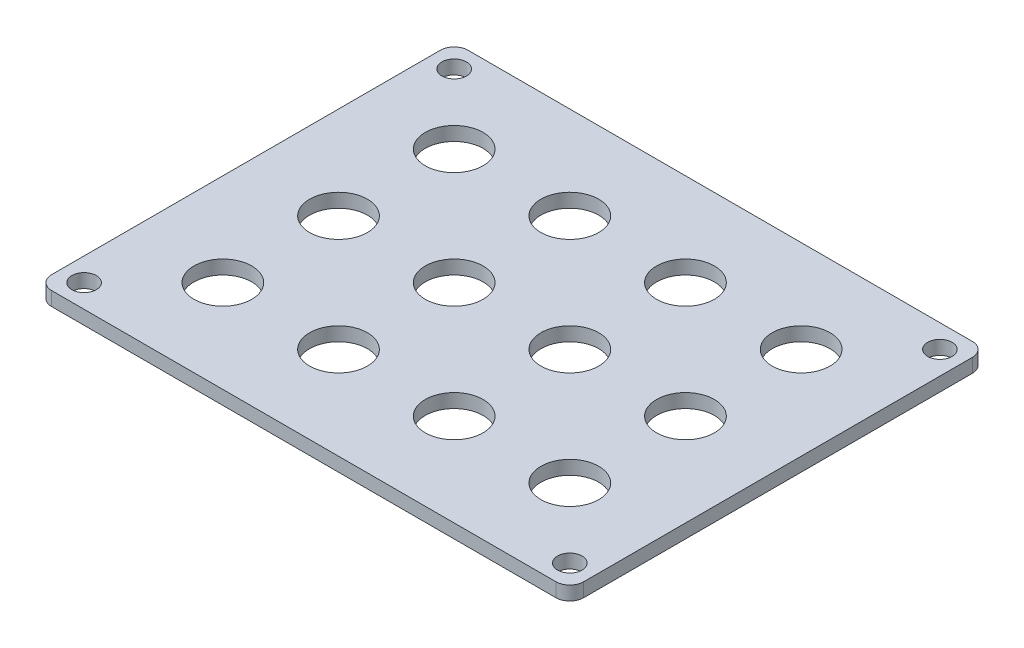
ISO-10303-21;
HEADER;
FILE_DESCRIPTION(('STEP AP214'),'2;1');
FILE_NAME('part.step','',(''),(''),'','','');
FILE_SCHEMA(('AUTOMOTIVE_DESIGN { 1 0 10303 214 1 1 1 1 }'));
ENDSEC;
DATA;
#1=APPLICATION_CONTEXT('core data for automotive mechanical design processes');
#2=APPLICATION_PROTOCOL_DEFINITION('international standard','automotive_design',2000,#1);
#3=PRODUCT_CONTEXT('',#1,'mechanical');
#4=PRODUCT('Part','Part','',(#3));
#5=PRODUCT_RELATED_PRODUCT_CATEGORY('part','',(#4));
#6=PRODUCT_DEFINITION_FORMATION('','',#4);
#7=PRODUCT_DEFINITION_CONTEXT('part definition',#1,'design');
#8=PRODUCT_DEFINITION('design','',#6,#7);
#9=PRODUCT_DEFINITION_SHAPE('','',#8);
#10=(LENGTH_UNIT() NAMED_UNIT(*) SI_UNIT(.MILLI.,.METRE.));
#11=(NAMED_UNIT(*) PLANE_ANGLE_UNIT() SI_UNIT($,.RADIAN.));
#12=(NAMED_UNIT(*) SI_UNIT($,.STERADIAN.) SOLID_ANGLE_UNIT());
#13=UNCERTAINTY_MEASURE_WITH_UNIT(LENGTH_MEASURE(1.E-05),#10,'distance_accuracy_value','');
#14=(GEOMETRIC_REPRESENTATION_CONTEXT(3) GLOBAL_UNCERTAINTY_ASSIGNED_CONTEXT((#13)) GLOBAL_UNIT_ASSIGNED_CONTEXT((#10,
#11,#12)) REPRESENTATION_CONTEXT('',''));
#15=CARTESIAN_POINT('',(0.,0.,0.));
#16=DIRECTION('',(0.,0.,1.));
#17=DIRECTION('',(1.,0.,0.));
#18=AXIS2_PLACEMENT_3D('',#15,#16,#17);
#19=CARTESIAN_POINT('',(0.,3.,0.));
#20=DIRECTION('',(0.,-1.,0.));
#21=DIRECTION('',(0.,0.,-1.));
#22=AXIS2_PLACEMENT_3D('',#19,#20,#21);
#23=PLANE('',#22);
#24=CARTESIAN_POINT('',(45.,3.,-70.));
#25=DIRECTION('',(0.,1.,0.));
#26=DIRECTION('',(0.,0.,1.));
#27=AXIS2_PLACEMENT_3D('',#24,#25,#26);
#28=CIRCLE('',#27,6.25);
#29=CARTESIAN_POINT('',(45.,3.,-63.75));
#30=VERTEX_POINT('',#29);
#31=EDGE_CURVE('E244',#30,#30,#28,.T.);
#32=ORIENTED_EDGE('',*,*,#31,.F.);
#33=EDGE_LOOP('',(#32));
#34=FACE_BOUND('',#33,.T.);
#35=CARTESIAN_POINT('',(20.,3.,-70.));
#36=DIRECTION('',(0.,1.,0.));
#37=DIRECTION('',(0.,0.,1.));
#38=AXIS2_PLACEMENT_3D('',#35,#36,#37);
#39=CIRCLE('',#38,6.25);
#40=CARTESIAN_POINT('',(20.,3.,-63.75));
#41=VERTEX_POINT('',#40);
#42=EDGE_CURVE('E231',#41,#41,#39,.T.);
#43=ORIENTED_EDGE('',*,*,#42,.F.);
#44=EDGE_LOOP('',(#43));
#45=FACE_BOUND('',#44,.T.);
#46=DIRECTION('',(0.,0.,-1.));
#47=VECTOR('',#46,1.);
#48=CARTESIAN_POINT('',(115.,3.,0.));
#49=LINE('',#48,#47);
#50=CARTESIAN_POINT('',(115.,3.,-3.));
#51=VERTEX_POINT('',#50);
#52=CARTESIAN_POINT('',(115.,3.,-87.));
#53=VERTEX_POINT('',#52);
#54=EDGE_CURVE('E235',#51,#53,#49,.T.);
#55=ORIENTED_EDGE('',*,*,#54,.T.);
#56=CARTESIAN_POINT('',(112.,3.,-87.));
#57=DIRECTION('',(0.,-1.,0.));
#58=DIRECTION('',(0.,0.,-1.));
#59=AXIS2_PLACEMENT_3D('',#56,#57,#58);
#60=CIRCLE('',#59,3.);
#61=CARTESIAN_POINT('',(112.,3.,-90.));
#62=VERTEX_POINT('',#61);
#63=EDGE_CURVE('E212',#53,#62,#60,.F.);
#64=ORIENTED_EDGE('',*,*,#63,.T.);
#65=DIRECTION('',(-1.,0.,0.));
#66=VECTOR('',#65,1.);
#67=CARTESIAN_POINT('',(0.,3.,-90.));
#68=LINE('',#67,#66);
#69=CARTESIAN_POINT('',(3.,3.,-90.));
#70=VERTEX_POINT('',#69);
#71=EDGE_CURVE('E123',#62,#70,#68,.T.);
#72=ORIENTED_EDGE('',*,*,#71,.T.);
#73=CARTESIAN_POINT('',(3.,3.,-87.));
#74=DIRECTION('',(0.,-1.,0.));
#75=DIRECTION('',(0.,0.,-1.));
#76=AXIS2_PLACEMENT_3D('',#73,#74,#75);
#77=CIRCLE('',#76,3.);
#78=CARTESIAN_POINT('',(0.,3.,-87.));
#79=VERTEX_POINT('',#78);
#80=EDGE_CURVE('E207',#70,#79,#77,.F.);
#81=ORIENTED_EDGE('',*,*,#80,.T.);
#82=DIRECTION('',(0.,0.,1.));
#83=VECTOR('',#82,1.);
#84=CARTESIAN_POINT('',(0.,3.,0.));
#85=LINE('',#84,#83);
#86=CARTESIAN_POINT('',(0.,3.,-3.));
#87=VERTEX_POINT('',#86);
#88=EDGE_CURVE('E130',#79,#87,#85,.T.);
#89=ORIENTED_EDGE('',*,*,#88,.T.);
#90=CARTESIAN_POINT('',(3.,3.,-3.));
#91=DIRECTION('',(0.,-1.,0.));
#92=DIRECTION('',(0.,0.,-1.));
#93=AXIS2_PLACEMENT_3D('',#90,#91,#92);
#94=CIRCLE('',#93,3.);
#95=CARTESIAN_POINT('',(3.,3.,0.));
#96=VERTEX_POINT('',#95);
#97=EDGE_CURVE('E59',#87,#96,#94,.F.);
#98=ORIENTED_EDGE('',*,*,#97,.T.);
#99=DIRECTION('',(1.,0.,0.));
#100=VECTOR('',#99,1.);
#101=CARTESIAN_POINT('',(0.,3.,0.));
#102=LINE('',#101,#100);
#103=CARTESIAN_POINT('',(112.,3.,0.));
#104=VERTEX_POINT('',#103);
#105=EDGE_CURVE('E133',#96,#104,#102,.T.);
#106=ORIENTED_EDGE('',*,*,#105,.T.);
#107=CARTESIAN_POINT('',(112.,3.,-3.));
#108=DIRECTION('',(0.,-1.,0.));
#109=DIRECTION('',(0.,0.,-1.));
#110=AXIS2_PLACEMENT_3D('',#107,#108,#109);
#111=CIRCLE('',#110,3.);
#112=EDGE_CURVE('E210',#104,#51,#111,.F.);
#113=ORIENTED_EDGE('',*,*,#112,.T.);
#114=EDGE_LOOP('',(#55,#64,#72,#81,#89,#98,#106,#113));
#115=FACE_BOUND('',#114,.T.);
#116=CARTESIAN_POINT('',(70.,3.,-70.));
#117=DIRECTION('',(0.,1.,0.));
#118=DIRECTION('',(0.,0.,1.));
#119=AXIS2_PLACEMENT_3D('',#116,#117,#118);
#120=CIRCLE('',#119,6.25);
#121=CARTESIAN_POINT('',(70.,3.,-63.75));
#122=VERTEX_POINT('',#121);
#123=EDGE_CURVE('E139',#122,#122,#120,.T.);
#124=ORIENTED_EDGE('',*,*,#123,.F.);
#125=EDGE_LOOP('',(#124));
#126=FACE_BOUND('',#125,.T.);
#127=CARTESIAN_POINT('',(95.,3.,-70.));
#128=DIRECTION('',(0.,1.,0.));
#129=DIRECTION('',(0.,0.,1.));
#130=AXIS2_PLACEMENT_3D('',#127,#128,#129);
#131=CIRCLE('',#130,6.25);
#132=CARTESIAN_POINT('',(95.,3.,-63.75));
#133=VERTEX_POINT('',#132);
#134=EDGE_CURVE('E145',#133,#133,#131,.T.);
#135=ORIENTED_EDGE('',*,*,#134,.F.);
#136=EDGE_LOOP('',(#135));
#137=FACE_BOUND('',#136,.T.);
#138=CARTESIAN_POINT('',(20.,3.,-45.));
#139=DIRECTION('',(0.,1.,0.));
#140=DIRECTION('',(0.,0.,1.));
#141=AXIS2_PLACEMENT_3D('',#138,#139,#140);
#142=CIRCLE('',#141,6.25);
#143=CARTESIAN_POINT('',(20.,3.,-38.75));
#144=VERTEX_POINT('',#143);
#145=EDGE_CURVE('E151',#144,#144,#142,.T.);
#146=ORIENTED_EDGE('',*,*,#145,.F.);
#147=EDGE_LOOP('',(#146));
#148=FACE_BOUND('',#147,.T.);
#149=CARTESIAN_POINT('',(45.,3.,-45.));
#150=DIRECTION('',(0.,1.,0.));
#151=DIRECTION('',(0.,0.,1.));
#152=AXIS2_PLACEMENT_3D('',#149,#150,#151);
#153=CIRCLE('',#152,6.25);
#154=CARTESIAN_POINT('',(45.,3.,-38.75));
#155=VERTEX_POINT('',#154);
#156=EDGE_CURVE('E157',#155,#155,#153,.T.);
#157=ORIENTED_EDGE('',*,*,#156,.F.);
#158=EDGE_LOOP('',(#157));
#159=FACE_BOUND('',#158,.T.);
#160=CARTESIAN_POINT('',(70.,3.,-45.));
#161=DIRECTION('',(0.,1.,0.));
#162=DIRECTION('',(0.,0.,1.));
#163=AXIS2_PLACEMENT_3D('',#160,#161,#162);
#164=CIRCLE('',#163,6.25);
#165=CARTESIAN_POINT('',(70.,3.,-38.75));
#166=VERTEX_POINT('',#165);
#167=EDGE_CURVE('E163',#166,#166,#164,.T.);
#168=ORIENTED_EDGE('',*,*,#167,.F.);
#169=EDGE_LOOP('',(#168));
#170=FACE_BOUND('',#169,.T.);
#171=CARTESIAN_POINT('',(95.,3.,-45.));
#172=DIRECTION('',(0.,1.,0.));
#173=DIRECTION('',(0.,0.,1.));
#174=AXIS2_PLACEMENT_3D('',#171,#172,#173);
#175=CIRCLE('',#174,6.25);
#176=CARTESIAN_POINT('',(95.,3.,-38.75));
#177=VERTEX_POINT('',#176);
#178=EDGE_CURVE('E169',#177,#177,#175,.T.);
#179=ORIENTED_EDGE('',*,*,#178,.F.);
#180=EDGE_LOOP('',(#179));
#181=FACE_BOUND('',#180,.T.);
#182=CARTESIAN_POINT('',(20.,3.,-20.));
#183=DIRECTION('',(0.,1.,0.));
#184=DIRECTION('',(0.,0.,1.));
#185=AXIS2_PLACEMENT_3D('',#182,#183,#184);
#186=CIRCLE('',#185,6.25);
#187=CARTESIAN_POINT('',(20.,3.,-13.75));
#188=VERTEX_POINT('',#187);
#189=EDGE_CURVE('E175',#188,#188,#186,.T.);
#190=ORIENTED_EDGE('',*,*,#189,.F.);
#191=EDGE_LOOP('',(#190));
#192=FACE_BOUND('',#191,.T.);
#193=CARTESIAN_POINT('',(45.,3.,-20.));
#194=DIRECTION('',(0.,1.,0.));
#195=DIRECTION('',(0.,0.,1.));
#196=AXIS2_PLACEMENT_3D('',#193,#194,#195);
#197=CIRCLE('',#196,6.25);
#198=CARTESIAN_POINT('',(45.,3.,-13.75));
#199=VERTEX_POINT('',#198);
#200=EDGE_CURVE('E181',#199,#199,#197,.T.);
#201=ORIENTED_EDGE('',*,*,#200,.F.);
#202=EDGE_LOOP('',(#201));
#203=FACE_BOUND('',#202,.T.);
#204=CARTESIAN_POINT('',(70.,3.,-20.));
#205=DIRECTION('',(0.,1.,0.));
#206=DIRECTION('',(0.,0.,1.));
#207=AXIS2_PLACEMENT_3D('',#204,#205,#206);
#208=CIRCLE('',#207,6.25);
#209=CARTESIAN_POINT('',(70.,3.,-13.75));
#210=VERTEX_POINT('',#209);
#211=EDGE_CURVE('E187',#210,#210,#208,.T.);
#212=ORIENTED_EDGE('',*,*,#211,.F.);
#213=EDGE_LOOP('',(#212));
#214=FACE_BOUND('',#213,.T.);
#215=CARTESIAN_POINT('',(95.,3.,-20.));
#216=DIRECTION('',(0.,1.,0.));
#217=DIRECTION('',(0.,0.,1.));
#218=AXIS2_PLACEMENT_3D('',#215,#216,#217);
#219=CIRCLE('',#218,6.25);
#220=CARTESIAN_POINT('',(95.,3.,-13.75));
#221=VERTEX_POINT('',#220);
#222=EDGE_CURVE('E193',#221,#221,#219,.T.);
#223=ORIENTED_EDGE('',*,*,#222,.F.);
#224=EDGE_LOOP('',(#223));
#225=FACE_BOUND('',#224,.T.);
#226=CARTESIAN_POINT('',(110.,3.,-85.));
#227=DIRECTION('',(0.,1.,0.));
#228=DIRECTION('',(0.,0.,1.));
#229=AXIS2_PLACEMENT_3D('',#226,#227,#228);
#230=CIRCLE('',#229,2.65);
#231=CARTESIAN_POINT('',(110.,3.,-82.35));
#232=VERTEX_POINT('',#231);
#233=EDGE_CURVE('E250',#232,#232,#230,.T.);
#234=ORIENTED_EDGE('',*,*,#233,.F.);
#235=EDGE_LOOP('',(#234));
#236=FACE_BOUND('',#235,.T.);
#237=CARTESIAN_POINT('',(110.,3.,-5.));
#238=DIRECTION('',(0.,1.,0.));
#239=DIRECTION('',(0.,0.,1.));
#240=AXIS2_PLACEMENT_3D('',#237,#238,#239);
#241=CIRCLE('',#240,2.65);
#242=CARTESIAN_POINT('',(110.,3.,-2.35));
#243=VERTEX_POINT('',#242);
#244=EDGE_CURVE('E256',#243,#243,#241,.T.);
#245=ORIENTED_EDGE('',*,*,#244,.F.);
#246=EDGE_LOOP('',(#245));
#247=FACE_BOUND('',#246,.T.);
#248=CARTESIAN_POINT('',(5.,3.,-4.99999999999999));
#249=DIRECTION('',(0.,1.,0.));
#250=DIRECTION('',(0.,0.,1.));
#251=AXIS2_PLACEMENT_3D('',#248,#249,#250);
#252=CIRCLE('',#251,2.65);
#253=CARTESIAN_POINT('',(5.,3.,-2.34999999999999));
#254=VERTEX_POINT('',#253);
#255=EDGE_CURVE('E262',#254,#254,#252,.T.);
#256=ORIENTED_EDGE('',*,*,#255,.F.);
#257=EDGE_LOOP('',(#256));
#258=FACE_BOUND('',#257,.T.);
#259=CARTESIAN_POINT('',(5.,3.,-85.));
#260=DIRECTION('',(0.,1.,0.));
#261=DIRECTION('',(0.,0.,1.));
#262=AXIS2_PLACEMENT_3D('',#259,#260,#261);
#263=CIRCLE('',#262,2.65);
#264=CARTESIAN_POINT('',(5.,3.,-82.35));
#265=VERTEX_POINT('',#264);
#266=EDGE_CURVE('E268',#265,#265,#263,.T.);
#267=ORIENTED_EDGE('',*,*,#266,.F.);
#268=EDGE_LOOP('',(#267));
#269=FACE_BOUND('',#268,.T.);
#270=ADVANCED_FACE('F37',(#34,#45,#115,#126,#137,#148,#159,#170,#181,#192,#203,#214,#225,#236,
#247,#258,#269),#23,.F.);
#271=CARTESIAN_POINT('',(95.,-17.6776695296637,-20.));
#272=DIRECTION('',(0.,1.,0.));
#273=DIRECTION('',(0.,0.,1.));
#274=AXIS2_PLACEMENT_3D('',#271,#272,#273);
#275=CYLINDRICAL_SURFACE('',#274,6.25);
#276=ORIENTED_EDGE('',*,*,#222,.T.);
#277=EDGE_LOOP('',(#276));
#278=FACE_BOUND('',#277,.T.);
#279=CARTESIAN_POINT('',(95.,0.,-20.));
#280=DIRECTION('',(0.,-1.,0.));
#281=DIRECTION('',(0.,0.,-1.));
#282=AXIS2_PLACEMENT_3D('',#279,#280,#281);
#283=CIRCLE('',#282,6.25);
#284=CARTESIAN_POINT('',(95.,0.,-26.25));
#285=VERTEX_POINT('',#284);
#286=EDGE_CURVE('E196',#285,#285,#283,.F.);
#287=ORIENTED_EDGE('',*,*,#286,.F.);
#288=EDGE_LOOP('',(#287));
#289=FACE_BOUND('',#288,.T.);
#290=ADVANCED_FACE('F276',(#278,#289),#275,.F.);
#291=CARTESIAN_POINT('',(70.,-17.6776695296637,-20.));
#292=DIRECTION('',(0.,1.,0.));
#293=DIRECTION('',(0.,0.,1.));
#294=AXIS2_PLACEMENT_3D('',#291,#292,#293);
#295=CYLINDRICAL_SURFACE('',#294,6.25);
#296=ORIENTED_EDGE('',*,*,#211,.T.);
#297=EDGE_LOOP('',(#296));
#298=FACE_BOUND('',#297,.T.);
#299=CARTESIAN_POINT('',(70.,0.,-20.));
#300=DIRECTION('',(0.,-1.,0.));
#301=DIRECTION('',(0.,0.,-1.));
#302=AXIS2_PLACEMENT_3D('',#299,#300,#301);
#303=CIRCLE('',#302,6.25);
#304=CARTESIAN_POINT('',(70.,0.,-26.25));
#305=VERTEX_POINT('',#304);
#306=EDGE_CURVE('E190',#305,#305,#303,.F.);
#307=ORIENTED_EDGE('',*,*,#306,.F.);
#308=EDGE_LOOP('',(#307));
#309=FACE_BOUND('',#308,.T.);
#310=ADVANCED_FACE('F282',(#298,#309),#295,.F.);
#311=CARTESIAN_POINT('',(45.,-17.6776695296637,-20.));
#312=DIRECTION('',(0.,1.,0.));
#313=DIRECTION('',(0.,0.,1.));
#314=AXIS2_PLACEMENT_3D('',#311,#312,#313);
#315=CYLINDRICAL_SURFACE('',#314,6.25);
#316=ORIENTED_EDGE('',*,*,#200,.T.);
#317=EDGE_LOOP('',(#316));
#318=FACE_BOUND('',#317,.T.);
#319=CARTESIAN_POINT('',(45.,0.,-20.));
#320=DIRECTION('',(0.,-1.,0.));
#321=DIRECTION('',(0.,0.,-1.));
#322=AXIS2_PLACEMENT_3D('',#319,#320,#321);
#323=CIRCLE('',#322,6.25);
#324=CARTESIAN_POINT('',(45.,0.,-26.25));
#325=VERTEX_POINT('',#324);
#326=EDGE_CURVE('E184',#325,#325,#323,.F.);
#327=ORIENTED_EDGE('',*,*,#326,.F.);
#328=EDGE_LOOP('',(#327));
#329=FACE_BOUND('',#328,.T.);
#330=ADVANCED_FACE('F332',(#318,#329),#315,.F.);
#331=CARTESIAN_POINT('',(20.,-17.6776695296637,-20.));
#332=DIRECTION('',(0.,1.,0.));
#333=DIRECTION('',(0.,0.,1.));
#334=AXIS2_PLACEMENT_3D('',#331,#332,#333);
#335=CYLINDRICAL_SURFACE('',#334,6.25);
#336=ORIENTED_EDGE('',*,*,#189,.T.);
#337=EDGE_LOOP('',(#336));
#338=FACE_BOUND('',#337,.T.);
#339=CARTESIAN_POINT('',(20.,0.,-20.));
#340=DIRECTION('',(0.,-1.,0.));
#341=DIRECTION('',(0.,0.,-1.));
#342=AXIS2_PLACEMENT_3D('',#339,#340,#341);
#343=CIRCLE('',#342,6.25);
#344=CARTESIAN_POINT('',(20.,0.,-26.25));
#345=VERTEX_POINT('',#344);
#346=EDGE_CURVE('E178',#345,#345,#343,.F.);
#347=ORIENTED_EDGE('',*,*,#346,.F.);
#348=EDGE_LOOP('',(#347));
#349=FACE_BOUND('',#348,.T.);
#350=ADVANCED_FACE('F328',(#338,#349),#335,.F.);
#351=CARTESIAN_POINT('',(95.,-17.6776695296637,-45.));
#352=DIRECTION('',(0.,1.,0.));
#353=DIRECTION('',(0.,0.,1.));
#354=AXIS2_PLACEMENT_3D('',#351,#352,#353);
#355=CYLINDRICAL_SURFACE('',#354,6.25);
#356=ORIENTED_EDGE('',*,*,#178,.T.);
#357=EDGE_LOOP('',(#356));
#358=FACE_BOUND('',#357,.T.);
#359=CARTESIAN_POINT('',(95.,0.,-45.));
#360=DIRECTION('',(0.,-1.,0.));
#361=DIRECTION('',(0.,0.,-1.));
#362=AXIS2_PLACEMENT_3D('',#359,#360,#361);
#363=CIRCLE('',#362,6.25);
#364=CARTESIAN_POINT('',(95.,0.,-51.25));
#365=VERTEX_POINT('',#364);
#366=EDGE_CURVE('E172',#365,#365,#363,.F.);
#367=ORIENTED_EDGE('',*,*,#366,.F.);
#368=EDGE_LOOP('',(#367));
#369=FACE_BOUND('',#368,.T.);
#370=ADVANCED_FACE('F324',(#358,#369),#355,.F.);
#371=CARTESIAN_POINT('',(70.,-17.6776695296637,-45.));
#372=DIRECTION('',(0.,1.,0.));
#373=DIRECTION('',(0.,0.,1.));
#374=AXIS2_PLACEMENT_3D('',#371,#372,#373);
#375=CYLINDRICAL_SURFACE('',#374,6.25);
#376=ORIENTED_EDGE('',*,*,#167,.T.);
#377=EDGE_LOOP('',(#376));
#378=FACE_BOUND('',#377,.T.);
#379=CARTESIAN_POINT('',(70.,0.,-45.));
#380=DIRECTION('',(0.,-1.,0.));
#381=DIRECTION('',(0.,0.,-1.));
#382=AXIS2_PLACEMENT_3D('',#379,#380,#381);
#383=CIRCLE('',#382,6.25);
#384=CARTESIAN_POINT('',(70.,0.,-51.25));
#385=VERTEX_POINT('',#384);
#386=EDGE_CURVE('E166',#385,#385,#383,.F.);
#387=ORIENTED_EDGE('',*,*,#386,.F.);
#388=EDGE_LOOP('',(#387));
#389=FACE_BOUND('',#388,.T.);
#390=ADVANCED_FACE('F320',(#378,#389),#375,.F.);
#391=CARTESIAN_POINT('',(45.,-17.6776695296637,-45.));
#392=DIRECTION('',(0.,1.,0.));
#393=DIRECTION('',(0.,0.,1.));
#394=AXIS2_PLACEMENT_3D('',#391,#392,#393);
#395=CYLINDRICAL_SURFACE('',#394,6.25);
#396=ORIENTED_EDGE('',*,*,#156,.T.);
#397=EDGE_LOOP('',(#396));
#398=FACE_BOUND('',#397,.T.);
#399=CARTESIAN_POINT('',(45.,0.,-45.));
#400=DIRECTION('',(0.,-1.,0.));
#401=DIRECTION('',(0.,0.,-1.));
#402=AXIS2_PLACEMENT_3D('',#399,#400,#401);
#403=CIRCLE('',#402,6.25);
#404=CARTESIAN_POINT('',(45.,0.,-51.25));
#405=VERTEX_POINT('',#404);
#406=EDGE_CURVE('E160',#405,#405,#403,.F.);
#407=ORIENTED_EDGE('',*,*,#406,.F.);
#408=EDGE_LOOP('',(#407));
#409=FACE_BOUND('',#408,.T.);
#410=ADVANCED_FACE('F316',(#398,#409),#395,.F.);
#411=CARTESIAN_POINT('',(20.,-17.6776695296637,-45.));
#412=DIRECTION('',(0.,1.,0.));
#413=DIRECTION('',(0.,0.,1.));
#414=AXIS2_PLACEMENT_3D('',#411,#412,#413);
#415=CYLINDRICAL_SURFACE('',#414,6.25);
#416=ORIENTED_EDGE('',*,*,#145,.T.);
#417=EDGE_LOOP('',(#416));
#418=FACE_BOUND('',#417,.T.);
#419=CARTESIAN_POINT('',(20.,0.,-45.));
#420=DIRECTION('',(0.,-1.,0.));
#421=DIRECTION('',(0.,0.,-1.));
#422=AXIS2_PLACEMENT_3D('',#419,#420,#421);
#423=CIRCLE('',#422,6.25);
#424=CARTESIAN_POINT('',(20.,0.,-51.25));
#425=VERTEX_POINT('',#424);
#426=EDGE_CURVE('E154',#425,#425,#423,.F.);
#427=ORIENTED_EDGE('',*,*,#426,.F.);
#428=EDGE_LOOP('',(#427));
#429=FACE_BOUND('',#428,.T.);
#430=ADVANCED_FACE('F312',(#418,#429),#415,.F.);
#431=CARTESIAN_POINT('',(95.,-17.6776695296637,-70.));
#432=DIRECTION('',(0.,1.,0.));
#433=DIRECTION('',(0.,0.,1.));
#434=AXIS2_PLACEMENT_3D('',#431,#432,#433);
#435=CYLINDRICAL_SURFACE('',#434,6.25);
#436=ORIENTED_EDGE('',*,*,#134,.T.);
#437=EDGE_LOOP('',(#436));
#438=FACE_BOUND('',#437,.T.);
#439=CARTESIAN_POINT('',(95.,0.,-70.));
#440=DIRECTION('',(0.,-1.,0.));
#441=DIRECTION('',(0.,0.,-1.));
#442=AXIS2_PLACEMENT_3D('',#439,#440,#441);
#443=CIRCLE('',#442,6.25);
#444=CARTESIAN_POINT('',(95.,0.,-76.25));
#445=VERTEX_POINT('',#444);
#446=EDGE_CURVE('E148',#445,#445,#443,.F.);
#447=ORIENTED_EDGE('',*,*,#446,.F.);
#448=EDGE_LOOP('',(#447));
#449=FACE_BOUND('',#448,.T.);
#450=ADVANCED_FACE('F308',(#438,#449),#435,.F.);
#451=CARTESIAN_POINT('',(70.,-17.6776695296637,-70.));
#452=DIRECTION('',(0.,1.,0.));
#453=DIRECTION('',(0.,0.,1.));
#454=AXIS2_PLACEMENT_3D('',#451,#452,#453);
#455=CYLINDRICAL_SURFACE('',#454,6.25);
#456=ORIENTED_EDGE('',*,*,#123,.T.);
#457=EDGE_LOOP('',(#456));
#458=FACE_BOUND('',#457,.T.);
#459=CARTESIAN_POINT('',(70.,0.,-70.));
#460=DIRECTION('',(0.,-1.,0.));
#461=DIRECTION('',(0.,0.,-1.));
#462=AXIS2_PLACEMENT_3D('',#459,#460,#461);
#463=CIRCLE('',#462,6.25);
#464=CARTESIAN_POINT('',(70.,0.,-76.25));
#465=VERTEX_POINT('',#464);
#466=EDGE_CURVE('E142',#465,#465,#463,.F.);
#467=ORIENTED_EDGE('',*,*,#466,.F.);
#468=EDGE_LOOP('',(#467));
#469=FACE_BOUND('',#468,.T.);
#470=ADVANCED_FACE('F305',(#458,#469),#455,.F.);
#471=CARTESIAN_POINT('',(0.,3.,0.));
#472=DIRECTION('',(1.,0.,0.));
#473=DIRECTION('',(0.,0.,-1.));
#474=AXIS2_PLACEMENT_3D('',#471,#472,#473);
#475=PLANE('',#474);
#476=DIRECTION('',(0.,0.,1.));
#477=VECTOR('',#476,1.);
#478=CARTESIAN_POINT('',(0.,0.,0.));
#479=LINE('',#478,#477);
#480=CARTESIAN_POINT('',(0.,0.,-87.));
#481=VERTEX_POINT('',#480);
#482=CARTESIAN_POINT('',(0.,0.,-3.));
#483=VERTEX_POINT('',#482);
#484=EDGE_CURVE('E223',#481,#483,#479,.T.);
#485=ORIENTED_EDGE('',*,*,#484,.T.);
#486=DIRECTION('',(0.,-1.,0.));
#487=VECTOR('',#486,1.);
#488=CARTESIAN_POINT('',(0.,3.,-3.));
#489=LINE('',#488,#487);
#490=EDGE_CURVE('E11',#483,#87,#489,.F.);
#491=ORIENTED_EDGE('',*,*,#490,.T.);
#492=ORIENTED_EDGE('',*,*,#88,.F.);
#493=DIRECTION('',(0.,-1.,0.));
#494=VECTOR('',#493,1.);
#495=CARTESIAN_POINT('',(0.,3.,-87.));
#496=LINE('',#495,#494);
#497=EDGE_CURVE('E45',#79,#481,#496,.T.);
#498=ORIENTED_EDGE('',*,*,#497,.T.);
#499=EDGE_LOOP('',(#485,#491,#492,#498));
#500=FACE_BOUND('',#499,.T.);
#501=ADVANCED_FACE('F222',(#500),#475,.F.);
#502=CARTESIAN_POINT('',(0.,3.,0.));
#503=DIRECTION('',(0.,0.,-1.));
#504=DIRECTION('',(-1.,0.,0.));
#505=AXIS2_PLACEMENT_3D('',#502,#503,#504);
#506=PLANE('',#505);
#507=DIRECTION('',(1.,0.,0.));
#508=VECTOR('',#507,1.);
#509=CARTESIAN_POINT('',(0.,0.,0.));
#510=LINE('',#509,#508);
#511=CARTESIAN_POINT('',(3.,0.,0.));
#512=VERTEX_POINT('',#511);
#513=CARTESIAN_POINT('',(112.,0.,0.));
#514=VERTEX_POINT('',#513);
#515=EDGE_CURVE('E135',#512,#514,#510,.T.);
#516=ORIENTED_EDGE('',*,*,#515,.T.);
#517=DIRECTION('',(0.,-1.,0.));
#518=VECTOR('',#517,1.);
#519=CARTESIAN_POINT('',(112.,3.,0.));
#520=LINE('',#519,#518);
#521=EDGE_CURVE('E52',#514,#104,#520,.F.);
#522=ORIENTED_EDGE('',*,*,#521,.T.);
#523=ORIENTED_EDGE('',*,*,#105,.F.);
#524=DIRECTION('',(0.,-1.,0.));
#525=VECTOR('',#524,1.);
#526=CARTESIAN_POINT('',(3.,3.,0.));
#527=LINE('',#526,#525);
#528=EDGE_CURVE('E214',#96,#512,#527,.T.);
#529=ORIENTED_EDGE('',*,*,#528,.T.);
#530=EDGE_LOOP('',(#516,#522,#523,#529));
#531=FACE_BOUND('',#530,.T.);
#532=ADVANCED_FACE('F299',(#531),#506,.F.);
#533=CARTESIAN_POINT('',(115.,3.,0.));
#534=DIRECTION('',(-1.,0.,0.));
#535=DIRECTION('',(0.,0.,1.));
#536=AXIS2_PLACEMENT_3D('',#533,#534,#535);
#537=PLANE('',#536);
#538=DIRECTION('',(0.,0.,-1.));
#539=VECTOR('',#538,1.);
#540=CARTESIAN_POINT('',(115.,0.,0.));
#541=LINE('',#540,#539);
#542=CARTESIAN_POINT('',(115.,0.,-3.));
#543=VERTEX_POINT('',#542);
#544=CARTESIAN_POINT('',(115.,0.,-87.));
#545=VERTEX_POINT('',#544);
#546=EDGE_CURVE('E131',#543,#545,#541,.T.);
#547=ORIENTED_EDGE('',*,*,#546,.T.);
#548=DIRECTION('',(0.,-1.,0.));
#549=VECTOR('',#548,1.);
#550=CARTESIAN_POINT('',(115.,3.,-87.));
#551=LINE('',#550,#549);
#552=EDGE_CURVE('E108',#545,#53,#551,.F.);
#553=ORIENTED_EDGE('',*,*,#552,.T.);
#554=ORIENTED_EDGE('',*,*,#54,.F.);
#555=DIRECTION('',(0.,-1.,0.));
#556=VECTOR('',#555,1.);
#557=CARTESIAN_POINT('',(115.,3.,-3.));
#558=LINE('',#557,#556);
#559=EDGE_CURVE('E113',#51,#543,#558,.T.);
#560=ORIENTED_EDGE('',*,*,#559,.T.);
#561=EDGE_LOOP('',(#547,#553,#554,#560));
#562=FACE_BOUND('',#561,.T.);
#563=ADVANCED_FACE('F296',(#562),#537,.F.);
#564=CARTESIAN_POINT('',(0.,3.,-90.));
#565=DIRECTION('',(0.,0.,1.));
#566=DIRECTION('',(1.,0.,0.));
#567=AXIS2_PLACEMENT_3D('',#564,#565,#566);
#568=PLANE('',#567);
#569=ORIENTED_EDGE('',*,*,#71,.F.);
#570=DIRECTION('',(0.,-1.,0.));
#571=VECTOR('',#570,1.);
#572=CARTESIAN_POINT('',(112.,3.,-90.));
#573=LINE('',#572,#571);
#574=CARTESIAN_POINT('',(112.,0.,-90.));
#575=VERTEX_POINT('',#574);
#576=EDGE_CURVE('E107',#62,#575,#573,.T.);
#577=ORIENTED_EDGE('',*,*,#576,.T.);
#578=DIRECTION('',(-1.,0.,0.));
#579=VECTOR('',#578,1.);
#580=CARTESIAN_POINT('',(0.,0.,-90.));
#581=LINE('',#580,#579);
#582=CARTESIAN_POINT('',(3.,0.,-90.));
#583=VERTEX_POINT('',#582);
#584=EDGE_CURVE('E120',#575,#583,#581,.T.);
#585=ORIENTED_EDGE('',*,*,#584,.T.);
#586=DIRECTION('',(0.,-1.,0.));
#587=VECTOR('',#586,1.);
#588=CARTESIAN_POINT('',(3.,3.,-90.));
#589=LINE('',#588,#587);
#590=EDGE_CURVE('E125',#583,#70,#589,.F.);
#591=ORIENTED_EDGE('',*,*,#590,.T.);
#592=EDGE_LOOP('',(#569,#577,#585,#591));
#593=FACE_BOUND('',#592,.T.);
#594=ADVANCED_FACE('F119',(#593),#568,.F.);
#595=CARTESIAN_POINT('',(0.,0.,0.));
#596=DIRECTION('',(0.,-1.,0.));
#597=DIRECTION('',(0.,0.,-1.));
#598=AXIS2_PLACEMENT_3D('',#595,#596,#597);
#599=PLANE('',#598);
#600=CARTESIAN_POINT('',(5.,0.,-85.));
#601=DIRECTION('',(0.,-1.,0.));
#602=DIRECTION('',(0.,0.,-1.));
#603=AXIS2_PLACEMENT_3D('',#600,#601,#602);
#604=CIRCLE('',#603,2.65);
#605=CARTESIAN_POINT('',(5.,0.,-87.65));
#606=VERTEX_POINT('',#605);
#607=EDGE_CURVE('E265',#606,#606,#604,.T.);
#608=ORIENTED_EDGE('',*,*,#607,.F.);
#609=EDGE_LOOP('',(#608));
#610=FACE_BOUND('',#609,.T.);
#611=CARTESIAN_POINT('',(5.,0.,-4.99999999999999));
#612=DIRECTION('',(0.,-1.,0.));
#613=DIRECTION('',(0.,0.,-1.));
#614=AXIS2_PLACEMENT_3D('',#611,#612,#613);
#615=CIRCLE('',#614,2.65);
#616=CARTESIAN_POINT('',(5.,0.,-7.64999999999999));
#617=VERTEX_POINT('',#616);
#618=EDGE_CURVE('E259',#617,#617,#615,.T.);
#619=ORIENTED_EDGE('',*,*,#618,.F.);
#620=EDGE_LOOP('',(#619));
#621=FACE_BOUND('',#620,.T.);
#622=CARTESIAN_POINT('',(110.,0.,-5.));
#623=DIRECTION('',(0.,-1.,0.));
#624=DIRECTION('',(0.,0.,-1.));
#625=AXIS2_PLACEMENT_3D('',#622,#623,#624);
#626=CIRCLE('',#625,2.65);
#627=CARTESIAN_POINT('',(110.,0.,-7.65));
#628=VERTEX_POINT('',#627);
#629=EDGE_CURVE('E253',#628,#628,#626,.T.);
#630=ORIENTED_EDGE('',*,*,#629,.F.);
#631=EDGE_LOOP('',(#630));
#632=FACE_BOUND('',#631,.T.);
#633=CARTESIAN_POINT('',(110.,0.,-85.));
#634=DIRECTION('',(0.,-1.,0.));
#635=DIRECTION('',(0.,0.,-1.));
#636=AXIS2_PLACEMENT_3D('',#633,#634,#635);
#637=CIRCLE('',#636,2.65);
#638=CARTESIAN_POINT('',(110.,0.,-87.65));
#639=VERTEX_POINT('',#638);
#640=EDGE_CURVE('E247',#639,#639,#637,.T.);
#641=ORIENTED_EDGE('',*,*,#640,.F.);
#642=EDGE_LOOP('',(#641));
#643=FACE_BOUND('',#642,.T.);
#644=CARTESIAN_POINT('',(45.,0.,-70.));
#645=DIRECTION('',(0.,-1.,0.));
#646=DIRECTION('',(0.,0.,-1.));
#647=AXIS2_PLACEMENT_3D('',#644,#645,#646);
#648=CIRCLE('',#647,6.25);
#649=CARTESIAN_POINT('',(45.,0.,-76.25));
#650=VERTEX_POINT('',#649);
#651=EDGE_CURVE('E241',#650,#650,#648,.F.);
#652=ORIENTED_EDGE('',*,*,#651,.T.);
#653=EDGE_LOOP('',(#652));
#654=FACE_BOUND('',#653,.T.);
#655=CARTESIAN_POINT('',(20.,0.,-70.));
#656=DIRECTION('',(0.,-1.,0.));
#657=DIRECTION('',(0.,0.,-1.));
#658=AXIS2_PLACEMENT_3D('',#655,#656,#657);
#659=CIRCLE('',#658,6.25);
#660=CARTESIAN_POINT('',(20.,0.,-76.25));
#661=VERTEX_POINT('',#660);
#662=EDGE_CURVE('E228',#661,#661,#659,.F.);
#663=ORIENTED_EDGE('',*,*,#662,.T.);
#664=EDGE_LOOP('',(#663));
#665=FACE_BOUND('',#664,.T.);
#666=ORIENTED_EDGE('',*,*,#584,.F.);
#667=CARTESIAN_POINT('',(112.,0.,-87.));
#668=DIRECTION('',(0.,-1.,0.));
#669=DIRECTION('',(0.,0.,-1.));
#670=AXIS2_PLACEMENT_3D('',#667,#668,#669);
#671=CIRCLE('',#670,3.);
#672=EDGE_CURVE('E103',#575,#545,#671,.T.);
#673=ORIENTED_EDGE('',*,*,#672,.T.);
#674=ORIENTED_EDGE('',*,*,#546,.F.);
#675=CARTESIAN_POINT('',(112.,0.,-3.));
#676=DIRECTION('',(0.,-1.,0.));
#677=DIRECTION('',(0.,0.,-1.));
#678=AXIS2_PLACEMENT_3D('',#675,#676,#677);
#679=CIRCLE('',#678,3.);
#680=EDGE_CURVE('E114',#543,#514,#679,.T.);
#681=ORIENTED_EDGE('',*,*,#680,.T.);
#682=ORIENTED_EDGE('',*,*,#515,.F.);
#683=CARTESIAN_POINT('',(3.,0.,-3.));
#684=DIRECTION('',(0.,-1.,0.));
#685=DIRECTION('',(0.,0.,-1.));
#686=AXIS2_PLACEMENT_3D('',#683,#684,#685);
#687=CIRCLE('',#686,3.);
#688=EDGE_CURVE('E201',#512,#483,#687,.T.);
#689=ORIENTED_EDGE('',*,*,#688,.T.);
#690=ORIENTED_EDGE('',*,*,#484,.F.);
#691=CARTESIAN_POINT('',(3.,0.,-87.));
#692=DIRECTION('',(0.,-1.,0.));
#693=DIRECTION('',(0.,0.,-1.));
#694=AXIS2_PLACEMENT_3D('',#691,#692,#693);
#695=CIRCLE('',#694,3.);
#696=EDGE_CURVE('E124',#481,#583,#695,.T.);
#697=ORIENTED_EDGE('',*,*,#696,.T.);
#698=EDGE_LOOP('',(#666,#673,#674,#681,#682,#689,#690,#697));
#699=FACE_BOUND('',#698,.T.);
#700=ORIENTED_EDGE('',*,*,#466,.T.);
#701=EDGE_LOOP('',(#700));
#702=FACE_BOUND('',#701,.T.);
#703=ORIENTED_EDGE('',*,*,#446,.T.);
#704=EDGE_LOOP('',(#703));
#705=FACE_BOUND('',#704,.T.);
#706=ORIENTED_EDGE('',*,*,#426,.T.);
#707=EDGE_LOOP('',(#706));
#708=FACE_BOUND('',#707,.T.);
#709=ORIENTED_EDGE('',*,*,#406,.T.);
#710=EDGE_LOOP('',(#709));
#711=FACE_BOUND('',#710,.T.);
#712=ORIENTED_EDGE('',*,*,#386,.T.);
#713=EDGE_LOOP('',(#712));
#714=FACE_BOUND('',#713,.T.);
#715=ORIENTED_EDGE('',*,*,#366,.T.);
#716=EDGE_LOOP('',(#715));
#717=FACE_BOUND('',#716,.T.);
#718=ORIENTED_EDGE('',*,*,#346,.T.);
#719=EDGE_LOOP('',(#718));
#720=FACE_BOUND('',#719,.T.);
#721=ORIENTED_EDGE('',*,*,#326,.T.);
#722=EDGE_LOOP('',(#721));
#723=FACE_BOUND('',#722,.T.);
#724=ORIENTED_EDGE('',*,*,#306,.T.);
#725=EDGE_LOOP('',(#724));
#726=FACE_BOUND('',#725,.T.);
#727=ORIENTED_EDGE('',*,*,#286,.T.);
#728=EDGE_LOOP('',(#727));
#729=FACE_BOUND('',#728,.T.);
#730=ADVANCED_FACE('F127',(#610,#621,#632,#643,#654,#665,#699,#702,#705,#708,#711,#714,#717,
#720,#723,#726,#729),#599,.T.);
#731=CARTESIAN_POINT('',(20.,-17.6776695296637,-70.));
#732=DIRECTION('',(0.,1.,0.));
#733=DIRECTION('',(0.,0.,1.));
#734=AXIS2_PLACEMENT_3D('',#731,#732,#733);
#735=CYLINDRICAL_SURFACE('',#734,6.25);
#736=ORIENTED_EDGE('',*,*,#42,.T.);
#737=EDGE_LOOP('',(#736));
#738=FACE_BOUND('',#737,.T.);
#739=ORIENTED_EDGE('',*,*,#662,.F.);
#740=EDGE_LOOP('',(#739));
#741=FACE_BOUND('',#740,.T.);
#742=ADVANCED_FACE('F289',(#738,#741),#735,.F.);
#743=CARTESIAN_POINT('',(45.,-17.6776695296637,-70.));
#744=DIRECTION('',(0.,1.,0.));
#745=DIRECTION('',(0.,0.,1.));
#746=AXIS2_PLACEMENT_3D('',#743,#744,#745);
#747=CYLINDRICAL_SURFACE('',#746,6.25);
#748=ORIENTED_EDGE('',*,*,#31,.T.);
#749=EDGE_LOOP('',(#748));
#750=FACE_BOUND('',#749,.T.);
#751=ORIENTED_EDGE('',*,*,#651,.F.);
#752=EDGE_LOOP('',(#751));
#753=FACE_BOUND('',#752,.T.);
#754=ADVANCED_FACE('F343',(#750,#753),#747,.F.);
#755=CARTESIAN_POINT('',(112.,3.,-87.));
#756=DIRECTION('',(0.,-1.,0.));
#757=DIRECTION('',(0.,0.,-1.));
#758=AXIS2_PLACEMENT_3D('',#755,#756,#757);
#759=CYLINDRICAL_SURFACE('',#758,3.);
#760=ORIENTED_EDGE('',*,*,#63,.F.);
#761=ORIENTED_EDGE('',*,*,#552,.F.);
#762=ORIENTED_EDGE('',*,*,#672,.F.);
#763=ORIENTED_EDGE('',*,*,#576,.F.);
#764=EDGE_LOOP('',(#760,#761,#762,#763));
#765=FACE_BOUND('',#764,.T.);
#766=ADVANCED_FACE('F106',(#765),#759,.T.);
#767=CARTESIAN_POINT('',(112.,3.,-3.));
#768=DIRECTION('',(0.,-1.,0.));
#769=DIRECTION('',(0.,0.,-1.));
#770=AXIS2_PLACEMENT_3D('',#767,#768,#769);
#771=CYLINDRICAL_SURFACE('',#770,3.);
#772=ORIENTED_EDGE('',*,*,#112,.F.);
#773=ORIENTED_EDGE('',*,*,#521,.F.);
#774=ORIENTED_EDGE('',*,*,#680,.F.);
#775=ORIENTED_EDGE('',*,*,#559,.F.);
#776=EDGE_LOOP('',(#772,#773,#774,#775));
#777=FACE_BOUND('',#776,.T.);
#778=ADVANCED_FACE('F342',(#777),#771,.T.);
#779=CARTESIAN_POINT('',(3.,3.,-3.));
#780=DIRECTION('',(0.,-1.,0.));
#781=DIRECTION('',(0.,0.,-1.));
#782=AXIS2_PLACEMENT_3D('',#779,#780,#781);
#783=CYLINDRICAL_SURFACE('',#782,3.);
#784=ORIENTED_EDGE('',*,*,#97,.F.);
#785=ORIENTED_EDGE('',*,*,#490,.F.);
#786=ORIENTED_EDGE('',*,*,#688,.F.);
#787=ORIENTED_EDGE('',*,*,#528,.F.);
#788=EDGE_LOOP('',(#784,#785,#786,#787));
#789=FACE_BOUND('',#788,.T.);
#790=ADVANCED_FACE('F345',(#789),#783,.T.);
#791=CARTESIAN_POINT('',(3.,3.,-87.));
#792=DIRECTION('',(0.,-1.,0.));
#793=DIRECTION('',(0.,0.,-1.));
#794=AXIS2_PLACEMENT_3D('',#791,#792,#793);
#795=CYLINDRICAL_SURFACE('',#794,3.);
#796=ORIENTED_EDGE('',*,*,#80,.F.);
#797=ORIENTED_EDGE('',*,*,#590,.F.);
#798=ORIENTED_EDGE('',*,*,#696,.F.);
#799=ORIENTED_EDGE('',*,*,#497,.F.);
#800=EDGE_LOOP('',(#796,#797,#798,#799));
#801=FACE_BOUND('',#800,.T.);
#802=ADVANCED_FACE('F39',(#801),#795,.T.);
#803=CARTESIAN_POINT('',(110.,3.,-85.));
#804=DIRECTION('',(0.,1.,0.));
#805=DIRECTION('',(0.,0.,1.));
#806=AXIS2_PLACEMENT_3D('',#803,#804,#805);
#807=CYLINDRICAL_SURFACE('',#806,2.65);
#808=ORIENTED_EDGE('',*,*,#233,.T.);
#809=EDGE_LOOP('',(#808));
#810=FACE_BOUND('',#809,.T.);
#811=ORIENTED_EDGE('',*,*,#640,.T.);
#812=EDGE_LOOP('',(#811));
#813=FACE_BOUND('',#812,.T.);
#814=ADVANCED_FACE('F352',(#810,#813),#807,.F.);
#815=CARTESIAN_POINT('',(110.,3.,-5.));
#816=DIRECTION('',(0.,1.,0.));
#817=DIRECTION('',(0.,0.,1.));
#818=AXIS2_PLACEMENT_3D('',#815,#816,#817);
#819=CYLINDRICAL_SURFACE('',#818,2.65);
#820=ORIENTED_EDGE('',*,*,#244,.T.);
#821=EDGE_LOOP('',(#820));
#822=FACE_BOUND('',#821,.T.);
#823=ORIENTED_EDGE('',*,*,#629,.T.);
#824=EDGE_LOOP('',(#823));
#825=FACE_BOUND('',#824,.T.);
#826=ADVANCED_FACE('F387',(#822,#825),#819,.F.);
#827=CARTESIAN_POINT('',(5.,3.,-4.99999999999999));
#828=DIRECTION('',(0.,1.,0.));
#829=DIRECTION('',(0.,0.,1.));
#830=AXIS2_PLACEMENT_3D('',#827,#828,#829);
#831=CYLINDRICAL_SURFACE('',#830,2.65);
#832=ORIENTED_EDGE('',*,*,#255,.T.);
#833=EDGE_LOOP('',(#832));
#834=FACE_BOUND('',#833,.T.);
#835=ORIENTED_EDGE('',*,*,#618,.T.);
#836=EDGE_LOOP('',(#835));
#837=FACE_BOUND('',#836,.T.);
#838=ADVANCED_FACE('F384',(#834,#837),#831,.F.);
#839=CARTESIAN_POINT('',(5.,3.,-85.));
#840=DIRECTION('',(0.,1.,0.));
#841=DIRECTION('',(0.,0.,1.));
#842=AXIS2_PLACEMENT_3D('',#839,#840,#841);
#843=CYLINDRICAL_SURFACE('',#842,2.65);
#844=ORIENTED_EDGE('',*,*,#266,.T.);
#845=EDGE_LOOP('',(#844));
#846=FACE_BOUND('',#845,.T.);
#847=ORIENTED_EDGE('',*,*,#607,.T.);
#848=EDGE_LOOP('',(#847));
#849=FACE_BOUND('',#848,.T.);
#850=ADVANCED_FACE('F272',(#846,#849),#843,.F.);
#851=CLOSED_SHELL('',(#270,#290,#310,#330,#350,#370,#390,#410,#430,#450,#470,#501,#532,#563,
#594,#730,#742,#754,#766,#778,#790,#802,#814,#826,#838,#850));
#852=MANIFOLD_SOLID_BREP('B2',#851);
#853=ADVANCED_BREP_SHAPE_REPRESENTATION('',(#18,#852),#14);
#854=SHAPE_DEFINITION_REPRESENTATION(#9,#853);
ENDSEC;
END-ISO-10303-21;
